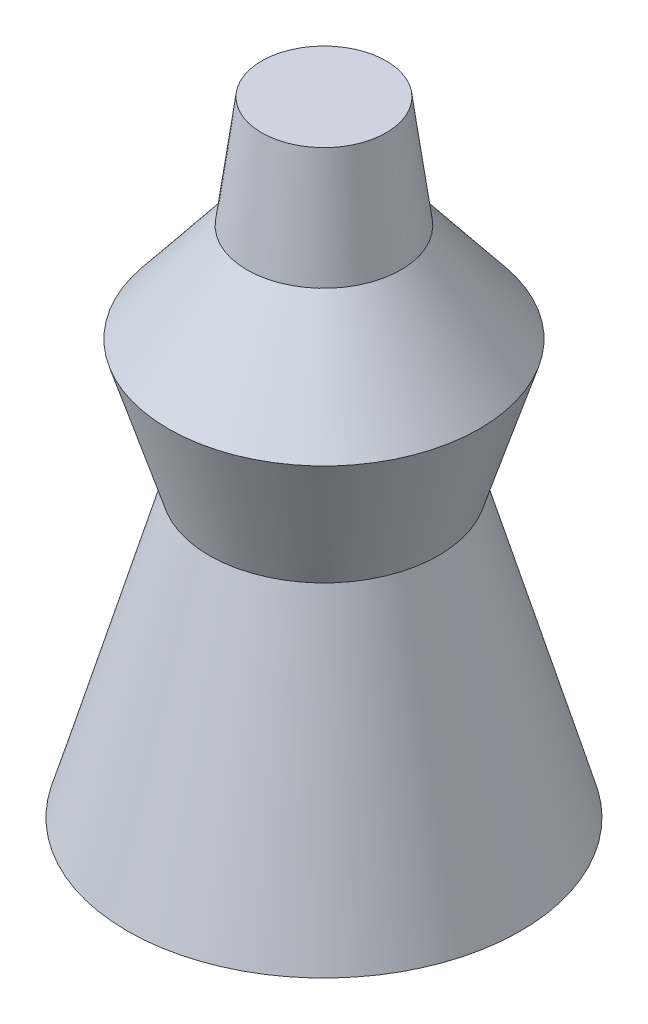
ISO-10303-21;
HEADER;
FILE_DESCRIPTION(('STEP AP214'),'2;1');
FILE_NAME('part.step','',(''),(''),'','','');
FILE_SCHEMA(('AUTOMOTIVE_DESIGN { 1 0 10303 214 1 1 1 1 }'));
ENDSEC;
DATA;
#1=APPLICATION_CONTEXT('core data for automotive mechanical design processes');
#2=APPLICATION_PROTOCOL_DEFINITION('international standard','automotive_design',2000,#1);
#3=PRODUCT_CONTEXT('',#1,'mechanical');
#4=PRODUCT('Part','Part','',(#3));
#5=PRODUCT_RELATED_PRODUCT_CATEGORY('part','',(#4));
#6=PRODUCT_DEFINITION_FORMATION('','',#4);
#7=PRODUCT_DEFINITION_CONTEXT('part definition',#1,'design');
#8=PRODUCT_DEFINITION('design','',#6,#7);
#9=PRODUCT_DEFINITION_SHAPE('','',#8);
#10=(LENGTH_UNIT() NAMED_UNIT(*) SI_UNIT(.MILLI.,.METRE.));
#11=(NAMED_UNIT(*) PLANE_ANGLE_UNIT() SI_UNIT($,.RADIAN.));
#12=(NAMED_UNIT(*) SI_UNIT($,.STERADIAN.) SOLID_ANGLE_UNIT());
#13=UNCERTAINTY_MEASURE_WITH_UNIT(LENGTH_MEASURE(1.E-05),#10,'distance_accuracy_value','');
#14=(GEOMETRIC_REPRESENTATION_CONTEXT(3) GLOBAL_UNCERTAINTY_ASSIGNED_CONTEXT((#13)) GLOBAL_UNIT_ASSIGNED_CONTEXT((#10,
#11,#12)) REPRESENTATION_CONTEXT('',''));
#15=CARTESIAN_POINT('',(0.,0.,0.));
#16=DIRECTION('',(0.,0.,1.));
#17=DIRECTION('',(1.,0.,0.));
#18=AXIS2_PLACEMENT_3D('',#15,#16,#17);
#19=CARTESIAN_POINT('',(8.60990107981263,47.0145914226611,0.));
#20=DIRECTION('',(0.,-1.,0.));
#21=DIRECTION('',(0.,0.,-1.));
#22=AXIS2_PLACEMENT_3D('',#19,#20,#21);
#23=PLANE('',#22);
#24=CARTESIAN_POINT('',(0.,47.0145914226611,0.));
#25=DIRECTION('',(0.,1.,0.));
#26=DIRECTION('',(0.,0.,1.));
#27=AXIS2_PLACEMENT_3D('',#24,#25,#26);
#28=CIRCLE('',#27,8.60990107981263);
#29=CARTESIAN_POINT('',(0.,47.0145914226611,8.60990107981263));
#30=VERTEX_POINT('',#29);
#31=EDGE_CURVE('E50',#30,#30,#28,.T.);
#32=ORIENTED_EDGE('',*,*,#31,.T.);
#33=EDGE_LOOP('',(#32));
#34=FACE_BOUND('',#33,.T.);
#35=ADVANCED_FACE('F31',(#34),#23,.F.);
#36=CARTESIAN_POINT('',(0.,-39.3109957196709,0.));
#37=DIRECTION('',(0.,1.,0.));
#38=DIRECTION('',(0.,0.,1.));
#39=AXIS2_PLACEMENT_3D('',#36,#37,#38);
#40=PLANE('',#39);
#41=CARTESIAN_POINT('',(0.,-39.3109957196709,0.));
#42=DIRECTION('',(0.,1.,0.));
#43=DIRECTION('',(0.,0.,1.));
#44=AXIS2_PLACEMENT_3D('',#41,#42,#43);
#45=CIRCLE('',#44,27.1891613046715);
#46=CARTESIAN_POINT('',(0.,-39.3109957196709,27.1891613046715));
#47=VERTEX_POINT('',#46);
#48=EDGE_CURVE('E10',#47,#47,#45,.T.);
#49=ORIENTED_EDGE('',*,*,#48,.F.);
#50=EDGE_LOOP('',(#49));
#51=FACE_BOUND('',#50,.T.);
#52=ADVANCED_FACE('F74',(#51),#40,.F.);
#53=CARTESIAN_POINT('',(0.,-39.3109957196709,0.));
#54=DIRECTION('',(0.,-1.,0.));
#55=DIRECTION('',(0.,0.,-1.));
#56=AXIS2_PLACEMENT_3D('',#53,#54,#55);
#57=CONICAL_SURFACE('',#56,27.1891613046715,0.280581891634562);
#58=CARTESIAN_POINT('',(0.,0.,0.));
#59=DIRECTION('',(0.,1.,0.));
#60=DIRECTION('',(0.,0.,1.));
#61=AXIS2_PLACEMENT_3D('',#58,#59,#60);
#62=CIRCLE('',#61,15.8603440943917);
#63=CARTESIAN_POINT('',(0.,0.,15.8603440943917));
#64=VERTEX_POINT('',#63);
#65=EDGE_CURVE('E37',#64,#64,#62,.T.);
#66=ORIENTED_EDGE('',*,*,#65,.F.);
#67=EDGE_LOOP('',(#66));
#68=FACE_BOUND('',#67,.T.);
#69=ORIENTED_EDGE('',*,*,#48,.T.);
#70=EDGE_LOOP('',(#69));
#71=FACE_BOUND('',#70,.T.);
#72=ADVANCED_FACE('F69',(#68,#71),#57,.T.);
#73=CARTESIAN_POINT('',(0.,0.,0.));
#74=DIRECTION('',(0.,1.,0.));
#75=DIRECTION('',(0.,0.,1.));
#76=AXIS2_PLACEMENT_3D('',#73,#74,#75);
#77=CONICAL_SURFACE('',#76,15.8603440943917,0.304674415498283);
#78=CARTESIAN_POINT('',(0.,18.0128193643449,0.));
#79=DIRECTION('',(0.,1.,0.));
#80=DIRECTION('',(0.,0.,1.));
#81=AXIS2_PLACEMENT_3D('',#78,#79,#80);
#82=CIRCLE('',#81,21.5247526995316);
#83=CARTESIAN_POINT('',(0.,18.0128193643449,21.5247526995316));
#84=VERTEX_POINT('',#83);
#85=EDGE_CURVE('E41',#84,#84,#82,.T.);
#86=ORIENTED_EDGE('',*,*,#85,.F.);
#87=EDGE_LOOP('',(#86));
#88=FACE_BOUND('',#87,.T.);
#89=ORIENTED_EDGE('',*,*,#65,.T.);
#90=EDGE_LOOP('',(#89));
#91=FACE_BOUND('',#90,.T.);
#92=ADVANCED_FACE('F64',(#88,#91),#77,.T.);
#93=CARTESIAN_POINT('',(0.,18.0128193643449,0.));
#94=DIRECTION('',(0.,-1.,0.));
#95=DIRECTION('',(0.,0.,-1.));
#96=AXIS2_PLACEMENT_3D('',#93,#94,#95);
#97=CONICAL_SURFACE('',#96,21.5247526995316,0.674740942223552);
#98=CARTESIAN_POINT('',(0.,31.6074000166806,0.));
#99=DIRECTION('',(0.,1.,0.));
#100=DIRECTION('',(0.,0.,1.));
#101=AXIS2_PLACEMENT_3D('',#98,#99,#100);
#102=CIRCLE('',#101,10.649088177663);
#103=CARTESIAN_POINT('',(0.,31.6074000166806,10.649088177663));
#104=VERTEX_POINT('',#103);
#105=EDGE_CURVE('E45',#104,#104,#102,.T.);
#106=ORIENTED_EDGE('',*,*,#105,.F.);
#107=EDGE_LOOP('',(#106));
#108=FACE_BOUND('',#107,.T.);
#109=ORIENTED_EDGE('',*,*,#85,.T.);
#110=EDGE_LOOP('',(#109));
#111=FACE_BOUND('',#110,.T.);
#112=ADVANCED_FACE('F58',(#108,#111),#97,.T.);
#113=CARTESIAN_POINT('',(0.,31.6074000166806,0.));
#114=DIRECTION('',(0.,-1.,0.));
#115=DIRECTION('',(0.,0.,-1.));
#116=AXIS2_PLACEMENT_3D('',#113,#114,#115);
#117=CONICAL_SURFACE('',#116,10.649088177663,0.131588141457921);
#118=ORIENTED_EDGE('',*,*,#31,.F.);
#119=EDGE_LOOP('',(#118));
#120=FACE_BOUND('',#119,.T.);
#121=ORIENTED_EDGE('',*,*,#105,.T.);
#122=EDGE_LOOP('',(#121));
#123=FACE_BOUND('',#122,.T.);
#124=ADVANCED_FACE('F55',(#120,#123),#117,.T.);
#125=CLOSED_SHELL('',(#35,#52,#72,#92,#112,#124));
#126=MANIFOLD_SOLID_BREP('B2',#125);
#127=ADVANCED_BREP_SHAPE_REPRESENTATION('',(#18,#126),#14);
#128=SHAPE_DEFINITION_REPRESENTATION(#9,#127);
ENDSEC;
END-ISO-10303-21;
